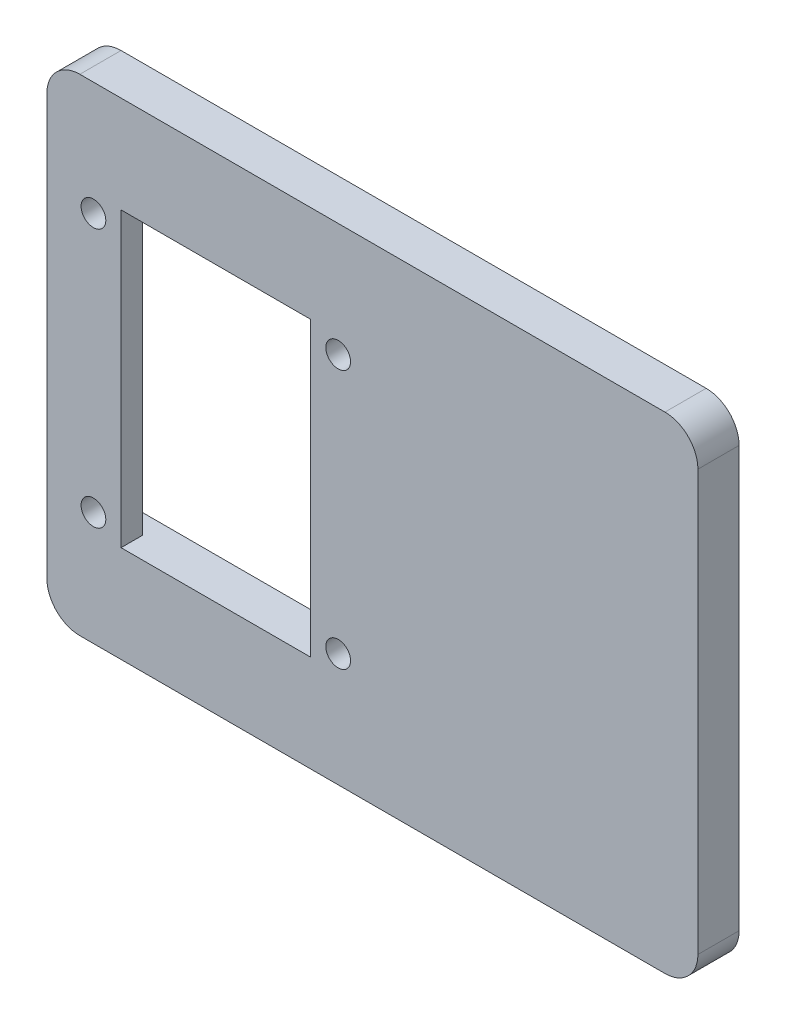
ISO-10303-21;
HEADER;
FILE_DESCRIPTION(('STEP AP214'),'2;1');
FILE_NAME('part.step','',(''),(''),'','','');
FILE_SCHEMA(('AUTOMOTIVE_DESIGN { 1 0 10303 214 1 1 1 1 }'));
ENDSEC;
DATA;
#1=APPLICATION_CONTEXT('core data for automotive mechanical design processes');
#2=APPLICATION_PROTOCOL_DEFINITION('international standard','automotive_design',2000,#1);
#3=PRODUCT_CONTEXT('',#1,'mechanical');
#4=PRODUCT('Part','Part','',(#3));
#5=PRODUCT_RELATED_PRODUCT_CATEGORY('part','',(#4));
#6=PRODUCT_DEFINITION_FORMATION('','',#4);
#7=PRODUCT_DEFINITION_CONTEXT('part definition',#1,'design');
#8=PRODUCT_DEFINITION('design','',#6,#7);
#9=PRODUCT_DEFINITION_SHAPE('','',#8);
#10=(LENGTH_UNIT() NAMED_UNIT(*) SI_UNIT(.MILLI.,.METRE.));
#11=(NAMED_UNIT(*) PLANE_ANGLE_UNIT() SI_UNIT($,.RADIAN.));
#12=(NAMED_UNIT(*) SI_UNIT($,.STERADIAN.) SOLID_ANGLE_UNIT());
#13=UNCERTAINTY_MEASURE_WITH_UNIT(LENGTH_MEASURE(1.E-05),#10,'distance_accuracy_value','');
#14=(GEOMETRIC_REPRESENTATION_CONTEXT(3) GLOBAL_UNCERTAINTY_ASSIGNED_CONTEXT((#13)) GLOBAL_UNIT_ASSIGNED_CONTEXT((#10,
#11,#12)) REPRESENTATION_CONTEXT('',''));
#15=CARTESIAN_POINT('',(0.,0.,0.));
#16=DIRECTION('',(0.,0.,1.));
#17=DIRECTION('',(1.,0.,0.));
#18=AXIS2_PLACEMENT_3D('',#15,#16,#17);
#19=CARTESIAN_POINT('',(0.,0.,5.));
#20=DIRECTION('',(0.,0.,-1.));
#21=DIRECTION('',(-1.,0.,0.));
#22=AXIS2_PLACEMENT_3D('',#19,#20,#21);
#23=PLANE('',#22);
#24=CARTESIAN_POINT('',(-33.85,15.71,5.));
#25=DIRECTION('',(0.,0.,1.));
#26=DIRECTION('',(1.,0.,0.));
#27=AXIS2_PLACEMENT_3D('',#24,#25,#26);
#28=CIRCLE('',#27,1.5);
#29=CARTESIAN_POINT('',(-32.35,15.71,5.));
#30=VERTEX_POINT('',#29);
#31=EDGE_CURVE('E202',#30,#30,#28,.T.);
#32=ORIENTED_EDGE('',*,*,#31,.F.);
#33=EDGE_LOOP('',(#32));
#34=FACE_BOUND('',#33,.T.);
#35=CARTESIAN_POINT('',(-4.14999999999999,15.71,5.));
#36=DIRECTION('',(0.,0.,1.));
#37=DIRECTION('',(1.,0.,0.));
#38=AXIS2_PLACEMENT_3D('',#35,#36,#37);
#39=CIRCLE('',#38,1.50000000000002);
#40=CARTESIAN_POINT('',(-2.64999999999997,15.71,5.));
#41=VERTEX_POINT('',#40);
#42=EDGE_CURVE('E235',#41,#41,#39,.F.);
#43=ORIENTED_EDGE('',*,*,#42,.T.);
#44=EDGE_LOOP('',(#43));
#45=FACE_BOUND('',#44,.T.);
#46=DIRECTION('',(-1.,0.,0.));
#47=VECTOR('',#46,1.);
#48=CARTESIAN_POINT('',(-39.5,29.5,5.));
#49=LINE('',#48,#47);
#50=CARTESIAN_POINT('',(35.5,29.5,5.));
#51=VERTEX_POINT('',#50);
#52=CARTESIAN_POINT('',(-35.5,29.5,5.));
#53=VERTEX_POINT('',#52);
#54=EDGE_CURVE('E248',#51,#53,#49,.T.);
#55=ORIENTED_EDGE('',*,*,#54,.T.);
#56=CARTESIAN_POINT('',(-35.5,25.5,5.));
#57=DIRECTION('',(0.,0.,-1.));
#58=DIRECTION('',(-1.,0.,0.));
#59=AXIS2_PLACEMENT_3D('',#56,#57,#58);
#60=CIRCLE('',#59,4.);
#61=CARTESIAN_POINT('',(-39.5,25.5,5.));
#62=VERTEX_POINT('',#61);
#63=EDGE_CURVE('E288',#53,#62,#60,.F.);
#64=ORIENTED_EDGE('',*,*,#63,.T.);
#65=DIRECTION('',(0.,-1.,0.));
#66=VECTOR('',#65,1.);
#67=CARTESIAN_POINT('',(-39.5,-29.5,5.));
#68=LINE('',#67,#66);
#69=CARTESIAN_POINT('',(-39.5,-25.5,5.));
#70=VERTEX_POINT('',#69);
#71=EDGE_CURVE('E252',#62,#70,#68,.T.);
#72=ORIENTED_EDGE('',*,*,#71,.T.);
#73=CARTESIAN_POINT('',(-35.5,-25.5,5.));
#74=DIRECTION('',(0.,0.,-1.));
#75=DIRECTION('',(-1.,0.,0.));
#76=AXIS2_PLACEMENT_3D('',#73,#74,#75);
#77=CIRCLE('',#76,4.);
#78=CARTESIAN_POINT('',(-35.5,-29.5,5.));
#79=VERTEX_POINT('',#78);
#80=EDGE_CURVE('E57',#70,#79,#77,.F.);
#81=ORIENTED_EDGE('',*,*,#80,.T.);
#82=DIRECTION('',(1.,0.,0.));
#83=VECTOR('',#82,1.);
#84=CARTESIAN_POINT('',(-39.5,-29.5,5.));
#85=LINE('',#84,#83);
#86=CARTESIAN_POINT('',(35.5,-29.5,5.));
#87=VERTEX_POINT('',#86);
#88=EDGE_CURVE('E254',#79,#87,#85,.T.);
#89=ORIENTED_EDGE('',*,*,#88,.T.);
#90=CARTESIAN_POINT('',(35.5,-25.5,5.));
#91=DIRECTION('',(0.,0.,-1.));
#92=DIRECTION('',(-1.,0.,0.));
#93=AXIS2_PLACEMENT_3D('',#90,#91,#92);
#94=CIRCLE('',#93,4.);
#95=CARTESIAN_POINT('',(39.5,-25.5,5.));
#96=VERTEX_POINT('',#95);
#97=EDGE_CURVE('E285',#87,#96,#94,.F.);
#98=ORIENTED_EDGE('',*,*,#97,.T.);
#99=DIRECTION('',(0.,1.,0.));
#100=VECTOR('',#99,1.);
#101=CARTESIAN_POINT('',(39.5,-29.5,5.));
#102=LINE('',#101,#100);
#103=CARTESIAN_POINT('',(39.5,25.5,5.));
#104=VERTEX_POINT('',#103);
#105=EDGE_CURVE('E245',#96,#104,#102,.T.);
#106=ORIENTED_EDGE('',*,*,#105,.T.);
#107=CARTESIAN_POINT('',(35.5,25.5,5.));
#108=DIRECTION('',(0.,0.,-1.));
#109=DIRECTION('',(-1.,0.,0.));
#110=AXIS2_PLACEMENT_3D('',#107,#108,#109);
#111=CIRCLE('',#110,4.);
#112=EDGE_CURVE('E283',#104,#51,#111,.F.);
#113=ORIENTED_EDGE('',*,*,#112,.T.);
#114=EDGE_LOOP('',(#55,#64,#72,#81,#89,#98,#106,#113));
#115=FACE_BOUND('',#114,.T.);
#116=DIRECTION('',(0.,1.,0.));
#117=VECTOR('',#116,1.);
#118=CARTESIAN_POINT('',(-7.49999999999999,0.,5.));
#119=LINE('',#118,#117);
#120=CARTESIAN_POINT('',(-7.49999999999999,-17.75,5.));
#121=VERTEX_POINT('',#120);
#122=CARTESIAN_POINT('',(-7.49999999999999,17.75,5.));
#123=VERTEX_POINT('',#122);
#124=EDGE_CURVE('E215',#121,#123,#119,.T.);
#125=ORIENTED_EDGE('',*,*,#124,.F.);
#126=DIRECTION('',(1.,0.,0.));
#127=VECTOR('',#126,1.);
#128=CARTESIAN_POINT('',(0.,-17.75,5.));
#129=LINE('',#128,#127);
#130=CARTESIAN_POINT('',(-30.5,-17.75,5.));
#131=VERTEX_POINT('',#130);
#132=EDGE_CURVE('E213',#131,#121,#129,.T.);
#133=ORIENTED_EDGE('',*,*,#132,.F.);
#134=DIRECTION('',(0.,1.,0.));
#135=VECTOR('',#134,1.);
#136=CARTESIAN_POINT('',(-30.5,0.,5.));
#137=LINE('',#136,#135);
#138=CARTESIAN_POINT('',(-30.5,17.75,5.));
#139=VERTEX_POINT('',#138);
#140=EDGE_CURVE('E209',#131,#139,#137,.T.);
#141=ORIENTED_EDGE('',*,*,#140,.T.);
#142=DIRECTION('',(1.,0.,0.));
#143=VECTOR('',#142,1.);
#144=CARTESIAN_POINT('',(0.,17.75,5.));
#145=LINE('',#144,#143);
#146=EDGE_CURVE('E218',#139,#123,#145,.T.);
#147=ORIENTED_EDGE('',*,*,#146,.T.);
#148=EDGE_LOOP('',(#125,#133,#141,#147));
#149=FACE_BOUND('',#148,.T.);
#150=CARTESIAN_POINT('',(-33.85,-15.71,5.));
#151=DIRECTION('',(0.,0.,1.));
#152=DIRECTION('',(1.,0.,0.));
#153=AXIS2_PLACEMENT_3D('',#150,#151,#152);
#154=CIRCLE('',#153,1.5);
#155=CARTESIAN_POINT('',(-32.35,-15.71,5.));
#156=VERTEX_POINT('',#155);
#157=EDGE_CURVE('E205',#156,#156,#154,.F.);
#158=ORIENTED_EDGE('',*,*,#157,.T.);
#159=EDGE_LOOP('',(#158));
#160=FACE_BOUND('',#159,.T.);
#161=CARTESIAN_POINT('',(-4.14999999999999,-15.71,5.));
#162=DIRECTION('',(0.,0.,1.));
#163=DIRECTION('',(1.,0.,0.));
#164=AXIS2_PLACEMENT_3D('',#161,#162,#163);
#165=CIRCLE('',#164,1.50000000000002);
#166=CARTESIAN_POINT('',(-2.64999999999997,-15.71,5.));
#167=VERTEX_POINT('',#166);
#168=EDGE_CURVE('E232',#167,#167,#165,.T.);
#169=ORIENTED_EDGE('',*,*,#168,.F.);
#170=EDGE_LOOP('',(#169));
#171=FACE_BOUND('',#170,.T.);
#172=ADVANCED_FACE('F35',(#34,#45,#115,#149,#160,#171),#23,.F.);
#173=CARTESIAN_POINT('',(39.5,-29.5,5.));
#174=DIRECTION('',(-1.,0.,0.));
#175=DIRECTION('',(0.,0.,1.));
#176=AXIS2_PLACEMENT_3D('',#173,#174,#175);
#177=PLANE('',#176);
#178=ORIENTED_EDGE('',*,*,#105,.F.);
#179=DIRECTION('',(0.,0.,-1.));
#180=VECTOR('',#179,1.);
#181=CARTESIAN_POINT('',(39.5,-25.5,5.));
#182=LINE('',#181,#180);
#183=CARTESIAN_POINT('',(39.5,-25.5,0.));
#184=VERTEX_POINT('',#183);
#185=EDGE_CURVE('E11',#96,#184,#182,.T.);
#186=ORIENTED_EDGE('',*,*,#185,.T.);
#187=DIRECTION('',(0.,1.,0.));
#188=VECTOR('',#187,1.);
#189=CARTESIAN_POINT('',(39.5,-29.5,0.));
#190=LINE('',#189,#188);
#191=CARTESIAN_POINT('',(39.5,25.5,0.));
#192=VERTEX_POINT('',#191);
#193=EDGE_CURVE('E244',#184,#192,#190,.T.);
#194=ORIENTED_EDGE('',*,*,#193,.T.);
#195=DIRECTION('',(0.,0.,-1.));
#196=VECTOR('',#195,1.);
#197=CARTESIAN_POINT('',(39.5,25.5,5.));
#198=LINE('',#197,#196);
#199=EDGE_CURVE('E43',#192,#104,#198,.F.);
#200=ORIENTED_EDGE('',*,*,#199,.T.);
#201=EDGE_LOOP('',(#178,#186,#194,#200));
#202=FACE_BOUND('',#201,.T.);
#203=ADVANCED_FACE('F296',(#202),#177,.F.);
#204=CARTESIAN_POINT('',(-39.5,29.5,5.));
#205=DIRECTION('',(0.,-1.,0.));
#206=DIRECTION('',(0.,0.,-1.));
#207=AXIS2_PLACEMENT_3D('',#204,#205,#206);
#208=PLANE('',#207);
#209=DIRECTION('',(-1.,0.,0.));
#210=VECTOR('',#209,1.);
#211=CARTESIAN_POINT('',(-39.5,29.5,0.));
#212=LINE('',#211,#210);
#213=CARTESIAN_POINT('',(35.5,29.5,0.));
#214=VERTEX_POINT('',#213);
#215=CARTESIAN_POINT('',(-35.5,29.5,0.));
#216=VERTEX_POINT('',#215);
#217=EDGE_CURVE('E259',#214,#216,#212,.T.);
#218=ORIENTED_EDGE('',*,*,#217,.T.);
#219=DIRECTION('',(0.,0.,-1.));
#220=VECTOR('',#219,1.);
#221=CARTESIAN_POINT('',(-35.5,29.5,5.));
#222=LINE('',#221,#220);
#223=EDGE_CURVE('E281',#216,#53,#222,.F.);
#224=ORIENTED_EDGE('',*,*,#223,.T.);
#225=ORIENTED_EDGE('',*,*,#54,.F.);
#226=DIRECTION('',(0.,0.,-1.));
#227=VECTOR('',#226,1.);
#228=CARTESIAN_POINT('',(35.5,29.5,5.));
#229=LINE('',#228,#227);
#230=EDGE_CURVE('E278',#51,#214,#229,.T.);
#231=ORIENTED_EDGE('',*,*,#230,.T.);
#232=EDGE_LOOP('',(#218,#224,#225,#231));
#233=FACE_BOUND('',#232,.T.);
#234=ADVANCED_FACE('F307',(#233),#208,.F.);
#235=CARTESIAN_POINT('',(-39.5,-29.5,5.));
#236=DIRECTION('',(1.,0.,0.));
#237=DIRECTION('',(0.,0.,-1.));
#238=AXIS2_PLACEMENT_3D('',#235,#236,#237);
#239=PLANE('',#238);
#240=ORIENTED_EDGE('',*,*,#71,.F.);
#241=DIRECTION('',(0.,0.,-1.));
#242=VECTOR('',#241,1.);
#243=CARTESIAN_POINT('',(-39.5,25.5,5.));
#244=LINE('',#243,#242);
#245=CARTESIAN_POINT('',(-39.5,25.5,0.));
#246=VERTEX_POINT('',#245);
#247=EDGE_CURVE('E267',#62,#246,#244,.T.);
#248=ORIENTED_EDGE('',*,*,#247,.T.);
#249=DIRECTION('',(0.,-1.,0.));
#250=VECTOR('',#249,1.);
#251=CARTESIAN_POINT('',(-39.5,-29.5,0.));
#252=LINE('',#251,#250);
#253=CARTESIAN_POINT('',(-39.5,-25.5,0.));
#254=VERTEX_POINT('',#253);
#255=EDGE_CURVE('E262',#246,#254,#252,.T.);
#256=ORIENTED_EDGE('',*,*,#255,.T.);
#257=DIRECTION('',(0.,0.,-1.));
#258=VECTOR('',#257,1.);
#259=CARTESIAN_POINT('',(-39.5,-25.5,5.));
#260=LINE('',#259,#258);
#261=EDGE_CURVE('E256',#254,#70,#260,.F.);
#262=ORIENTED_EDGE('',*,*,#261,.T.);
#263=EDGE_LOOP('',(#240,#248,#256,#262));
#264=FACE_BOUND('',#263,.T.);
#265=ADVANCED_FACE('F318',(#264),#239,.F.);
#266=CARTESIAN_POINT('',(-39.5,-29.5,5.));
#267=DIRECTION('',(0.,1.,0.));
#268=DIRECTION('',(0.,0.,1.));
#269=AXIS2_PLACEMENT_3D('',#266,#267,#268);
#270=PLANE('',#269);
#271=ORIENTED_EDGE('',*,*,#88,.F.);
#272=DIRECTION('',(0.,0.,-1.));
#273=VECTOR('',#272,1.);
#274=CARTESIAN_POINT('',(-35.5,-29.5,5.));
#275=LINE('',#274,#273);
#276=CARTESIAN_POINT('',(-35.5,-29.5,0.));
#277=VERTEX_POINT('',#276);
#278=EDGE_CURVE('E291',#79,#277,#275,.T.);
#279=ORIENTED_EDGE('',*,*,#278,.T.);
#280=DIRECTION('',(1.,0.,0.));
#281=VECTOR('',#280,1.);
#282=CARTESIAN_POINT('',(-39.5,-29.5,0.));
#283=LINE('',#282,#281);
#284=CARTESIAN_POINT('',(35.5,-29.5,0.));
#285=VERTEX_POINT('',#284);
#286=EDGE_CURVE('E249',#277,#285,#283,.T.);
#287=ORIENTED_EDGE('',*,*,#286,.T.);
#288=DIRECTION('',(0.,0.,-1.));
#289=VECTOR('',#288,1.);
#290=CARTESIAN_POINT('',(35.5,-29.5,5.));
#291=LINE('',#290,#289);
#292=EDGE_CURVE('E50',#285,#87,#291,.F.);
#293=ORIENTED_EDGE('',*,*,#292,.T.);
#294=EDGE_LOOP('',(#271,#279,#287,#293));
#295=FACE_BOUND('',#294,.T.);
#296=ADVANCED_FACE('F324',(#295),#270,.F.);
#297=CARTESIAN_POINT('',(0.,0.,0.));
#298=DIRECTION('',(0.,0.,-1.));
#299=DIRECTION('',(-1.,0.,0.));
#300=AXIS2_PLACEMENT_3D('',#297,#298,#299);
#301=PLANE('',#300);
#302=DIRECTION('',(1.,0.,0.));
#303=VECTOR('',#302,1.);
#304=CARTESIAN_POINT('',(0.,17.75,0.));
#305=LINE('',#304,#303);
#306=CARTESIAN_POINT('',(-35.85,17.75,0.));
#307=VERTEX_POINT('',#306);
#308=CARTESIAN_POINT('',(-2.14999999999999,17.75,0.));
#309=VERTEX_POINT('',#308);
#310=EDGE_CURVE('E167',#307,#309,#305,.T.);
#311=ORIENTED_EDGE('',*,*,#310,.F.);
#312=DIRECTION('',(0.,-1.,0.));
#313=VECTOR('',#312,1.);
#314=CARTESIAN_POINT('',(-35.85,0.,0.));
#315=LINE('',#314,#313);
#316=CARTESIAN_POINT('',(-35.85,-17.75,0.));
#317=VERTEX_POINT('',#316);
#318=EDGE_CURVE('E160',#307,#317,#315,.T.);
#319=ORIENTED_EDGE('',*,*,#318,.T.);
#320=DIRECTION('',(1.,0.,0.));
#321=VECTOR('',#320,1.);
#322=CARTESIAN_POINT('',(0.,-17.75,0.));
#323=LINE('',#322,#321);
#324=CARTESIAN_POINT('',(-2.15,-17.75,0.));
#325=VERTEX_POINT('',#324);
#326=EDGE_CURVE('E186',#317,#325,#323,.T.);
#327=ORIENTED_EDGE('',*,*,#326,.T.);
#328=DIRECTION('',(0.,-1.,0.));
#329=VECTOR('',#328,1.);
#330=CARTESIAN_POINT('',(-2.15,0.,0.));
#331=LINE('',#330,#329);
#332=EDGE_CURVE('E184',#309,#325,#331,.T.);
#333=ORIENTED_EDGE('',*,*,#332,.F.);
#334=EDGE_LOOP('',(#311,#319,#327,#333));
#335=FACE_BOUND('',#334,.T.);
#336=ORIENTED_EDGE('',*,*,#255,.F.);
#337=CARTESIAN_POINT('',(-35.5,25.5,0.));
#338=DIRECTION('',(0.,0.,-1.));
#339=DIRECTION('',(-1.,0.,0.));
#340=AXIS2_PLACEMENT_3D('',#337,#338,#339);
#341=CIRCLE('',#340,4.);
#342=EDGE_CURVE('E276',#246,#216,#341,.T.);
#343=ORIENTED_EDGE('',*,*,#342,.T.);
#344=ORIENTED_EDGE('',*,*,#217,.F.);
#345=CARTESIAN_POINT('',(35.5,25.5,0.));
#346=DIRECTION('',(0.,0.,-1.));
#347=DIRECTION('',(-1.,0.,0.));
#348=AXIS2_PLACEMENT_3D('',#345,#346,#347);
#349=CIRCLE('',#348,4.);
#350=EDGE_CURVE('E270',#214,#192,#349,.T.);
#351=ORIENTED_EDGE('',*,*,#350,.T.);
#352=ORIENTED_EDGE('',*,*,#193,.F.);
#353=CARTESIAN_POINT('',(35.5,-25.5,0.));
#354=DIRECTION('',(0.,0.,-1.));
#355=DIRECTION('',(-1.,0.,0.));
#356=AXIS2_PLACEMENT_3D('',#353,#354,#355);
#357=CIRCLE('',#356,4.);
#358=EDGE_CURVE('E272',#184,#285,#357,.T.);
#359=ORIENTED_EDGE('',*,*,#358,.T.);
#360=ORIENTED_EDGE('',*,*,#286,.F.);
#361=CARTESIAN_POINT('',(-35.5,-25.5,0.));
#362=DIRECTION('',(0.,0.,-1.));
#363=DIRECTION('',(-1.,0.,0.));
#364=AXIS2_PLACEMENT_3D('',#361,#362,#363);
#365=CIRCLE('',#364,4.);
#366=EDGE_CURVE('E274',#277,#254,#365,.T.);
#367=ORIENTED_EDGE('',*,*,#366,.T.);
#368=EDGE_LOOP('',(#336,#343,#344,#351,#352,#359,#360,#367));
#369=FACE_BOUND('',#368,.T.);
#370=ADVANCED_FACE('F311',(#335,#369),#301,.T.);
#371=CARTESIAN_POINT('',(-4.14999999999999,15.71,2.4));
#372=DIRECTION('',(0.,0.,1.));
#373=DIRECTION('',(1.,0.,0.));
#374=AXIS2_PLACEMENT_3D('',#371,#372,#373);
#375=CYLINDRICAL_SURFACE('',#374,1.50000000000002);
#376=CARTESIAN_POINT('',(-4.14999999999999,15.71,2.4));
#377=DIRECTION('',(0.,0.,1.));
#378=DIRECTION('',(1.,0.,0.));
#379=AXIS2_PLACEMENT_3D('',#376,#377,#378);
#380=CIRCLE('',#379,1.50000000000002);
#381=CARTESIAN_POINT('',(-2.64999999999997,15.71,2.4));
#382=VERTEX_POINT('',#381);
#383=EDGE_CURVE('E200',#382,#382,#380,.F.);
#384=ORIENTED_EDGE('',*,*,#383,.T.);
#385=EDGE_LOOP('',(#384));
#386=FACE_BOUND('',#385,.T.);
#387=ORIENTED_EDGE('',*,*,#42,.F.);
#388=EDGE_LOOP('',(#387));
#389=FACE_BOUND('',#388,.T.);
#390=ADVANCED_FACE('F344',(#386,#389),#375,.F.);
#391=CARTESIAN_POINT('',(0.,-17.75,2.4));
#392=DIRECTION('',(0.,-1.,0.));
#393=DIRECTION('',(0.,0.,-1.));
#394=AXIS2_PLACEMENT_3D('',#391,#392,#393);
#395=PLANE('',#394);
#396=ORIENTED_EDGE('',*,*,#132,.T.);
#397=DIRECTION('',(0.,0.,1.));
#398=VECTOR('',#397,1.);
#399=CARTESIAN_POINT('',(-7.49999999999999,-17.75,2.4));
#400=LINE('',#399,#398);
#401=CARTESIAN_POINT('',(-7.49999999999999,-17.75,2.4));
#402=VERTEX_POINT('',#401);
#403=EDGE_CURVE('E212',#402,#121,#400,.T.);
#404=ORIENTED_EDGE('',*,*,#403,.F.);
#405=DIRECTION('',(1.,0.,0.));
#406=VECTOR('',#405,1.);
#407=CARTESIAN_POINT('',(0.,-17.75,2.4));
#408=LINE('',#407,#406);
#409=CARTESIAN_POINT('',(-2.15,-17.75,2.4));
#410=VERTEX_POINT('',#409);
#411=EDGE_CURVE('E176',#402,#410,#408,.T.);
#412=ORIENTED_EDGE('',*,*,#411,.T.);
#413=DIRECTION('',(0.,0.,-1.));
#414=VECTOR('',#413,1.);
#415=CARTESIAN_POINT('',(-2.15,-17.75,2.4));
#416=LINE('',#415,#414);
#417=EDGE_CURVE('E171',#410,#325,#416,.T.);
#418=ORIENTED_EDGE('',*,*,#417,.T.);
#419=ORIENTED_EDGE('',*,*,#326,.F.);
#420=DIRECTION('',(0.,0.,-1.));
#421=VECTOR('',#420,1.);
#422=CARTESIAN_POINT('',(-35.85,-17.75,2.4));
#423=LINE('',#422,#421);
#424=CARTESIAN_POINT('',(-35.85,-17.75,2.4));
#425=VERTEX_POINT('',#424);
#426=EDGE_CURVE('E194',#425,#317,#423,.T.);
#427=ORIENTED_EDGE('',*,*,#426,.F.);
#428=CARTESIAN_POINT('',(-30.5,-17.75,2.4));
#429=VERTEX_POINT('',#428);
#430=EDGE_CURVE('E178',#425,#429,#408,.T.);
#431=ORIENTED_EDGE('',*,*,#430,.T.);
#432=DIRECTION('',(0.,0.,1.));
#433=VECTOR('',#432,1.);
#434=CARTESIAN_POINT('',(-30.5,-17.75,2.4));
#435=LINE('',#434,#433);
#436=EDGE_CURVE('E206',#429,#131,#435,.T.);
#437=ORIENTED_EDGE('',*,*,#436,.T.);
#438=EDGE_LOOP('',(#396,#404,#412,#418,#419,#427,#431,#437));
#439=FACE_BOUND('',#438,.T.);
#440=ADVANCED_FACE('F378',(#439),#395,.F.);
#441=CARTESIAN_POINT('',(-30.5,0.,2.4));
#442=DIRECTION('',(1.,0.,0.));
#443=DIRECTION('',(0.,0.,-1.));
#444=AXIS2_PLACEMENT_3D('',#441,#442,#443);
#445=PLANE('',#444);
#446=ORIENTED_EDGE('',*,*,#140,.F.);
#447=ORIENTED_EDGE('',*,*,#436,.F.);
#448=DIRECTION('',(0.,1.,0.));
#449=VECTOR('',#448,1.);
#450=CARTESIAN_POINT('',(-30.5,0.,2.4));
#451=LINE('',#450,#449);
#452=CARTESIAN_POINT('',(-30.5,17.75,2.4));
#453=VERTEX_POINT('',#452);
#454=EDGE_CURVE('E208',#429,#453,#451,.T.);
#455=ORIENTED_EDGE('',*,*,#454,.T.);
#456=DIRECTION('',(0.,0.,1.));
#457=VECTOR('',#456,1.);
#458=CARTESIAN_POINT('',(-30.5,17.75,2.4));
#459=LINE('',#458,#457);
#460=EDGE_CURVE('E224',#453,#139,#459,.T.);
#461=ORIENTED_EDGE('',*,*,#460,.T.);
#462=EDGE_LOOP('',(#446,#447,#455,#461));
#463=FACE_BOUND('',#462,.T.);
#464=ADVANCED_FACE('F375',(#463),#445,.T.);
#465=CARTESIAN_POINT('',(0.,17.75,2.4));
#466=DIRECTION('',(0.,-1.,0.));
#467=DIRECTION('',(0.,0.,-1.));
#468=AXIS2_PLACEMENT_3D('',#465,#466,#467);
#469=PLANE('',#468);
#470=ORIENTED_EDGE('',*,*,#146,.F.);
#471=ORIENTED_EDGE('',*,*,#460,.F.);
#472=DIRECTION('',(1.,0.,0.));
#473=VECTOR('',#472,1.);
#474=CARTESIAN_POINT('',(0.,17.75,2.4));
#475=LINE('',#474,#473);
#476=CARTESIAN_POINT('',(-35.85,17.75,2.4));
#477=VERTEX_POINT('',#476);
#478=EDGE_CURVE('E159',#477,#453,#475,.T.);
#479=ORIENTED_EDGE('',*,*,#478,.F.);
#480=DIRECTION('',(0.,0.,-1.));
#481=VECTOR('',#480,1.);
#482=CARTESIAN_POINT('',(-35.85,17.75,2.4));
#483=LINE('',#482,#481);
#484=EDGE_CURVE('E191',#477,#307,#483,.T.);
#485=ORIENTED_EDGE('',*,*,#484,.T.);
#486=ORIENTED_EDGE('',*,*,#310,.T.);
#487=DIRECTION('',(0.,0.,-1.));
#488=VECTOR('',#487,1.);
#489=CARTESIAN_POINT('',(-2.14999999999999,17.75,2.4));
#490=LINE('',#489,#488);
#491=CARTESIAN_POINT('',(-2.14999999999999,17.75,2.4));
#492=VERTEX_POINT('',#491);
#493=EDGE_CURVE('E163',#492,#309,#490,.T.);
#494=ORIENTED_EDGE('',*,*,#493,.F.);
#495=CARTESIAN_POINT('',(-7.49999999999999,17.75,2.4));
#496=VERTEX_POINT('',#495);
#497=EDGE_CURVE('E150',#496,#492,#475,.T.);
#498=ORIENTED_EDGE('',*,*,#497,.F.);
#499=DIRECTION('',(0.,0.,1.));
#500=VECTOR('',#499,1.);
#501=CARTESIAN_POINT('',(-7.49999999999999,17.75,2.4));
#502=LINE('',#501,#500);
#503=EDGE_CURVE('E226',#496,#123,#502,.T.);
#504=ORIENTED_EDGE('',*,*,#503,.T.);
#505=EDGE_LOOP('',(#470,#471,#479,#485,#486,#494,#498,#504));
#506=FACE_BOUND('',#505,.T.);
#507=ADVANCED_FACE('F165',(#506),#469,.T.);
#508=CARTESIAN_POINT('',(-7.49999999999999,0.,2.4));
#509=DIRECTION('',(1.,0.,0.));
#510=DIRECTION('',(0.,0.,-1.));
#511=AXIS2_PLACEMENT_3D('',#508,#509,#510);
#512=PLANE('',#511);
#513=ORIENTED_EDGE('',*,*,#124,.T.);
#514=ORIENTED_EDGE('',*,*,#503,.F.);
#515=DIRECTION('',(0.,1.,0.));
#516=VECTOR('',#515,1.);
#517=CARTESIAN_POINT('',(-7.49999999999999,0.,2.4));
#518=LINE('',#517,#516);
#519=EDGE_CURVE('E156',#402,#496,#518,.T.);
#520=ORIENTED_EDGE('',*,*,#519,.F.);
#521=ORIENTED_EDGE('',*,*,#403,.T.);
#522=EDGE_LOOP('',(#513,#514,#520,#521));
#523=FACE_BOUND('',#522,.T.);
#524=ADVANCED_FACE('F373',(#523),#512,.F.);
#525=CARTESIAN_POINT('',(-33.85,15.71,2.4));
#526=DIRECTION('',(0.,0.,1.));
#527=DIRECTION('',(1.,0.,0.));
#528=AXIS2_PLACEMENT_3D('',#525,#526,#527);
#529=CYLINDRICAL_SURFACE('',#528,1.5);
#530=CARTESIAN_POINT('',(-33.85,15.71,2.4));
#531=DIRECTION('',(0.,0.,1.));
#532=DIRECTION('',(1.,0.,0.));
#533=AXIS2_PLACEMENT_3D('',#530,#531,#532);
#534=CIRCLE('',#533,1.5);
#535=CARTESIAN_POINT('',(-32.35,15.71,2.4));
#536=VERTEX_POINT('',#535);
#537=EDGE_CURVE('E197',#536,#536,#534,.T.);
#538=ORIENTED_EDGE('',*,*,#537,.F.);
#539=EDGE_LOOP('',(#538));
#540=FACE_BOUND('',#539,.T.);
#541=ORIENTED_EDGE('',*,*,#31,.T.);
#542=EDGE_LOOP('',(#541));
#543=FACE_BOUND('',#542,.T.);
#544=ADVANCED_FACE('F369',(#540,#543),#529,.F.);
#545=CARTESIAN_POINT('',(-33.85,-15.71,2.4));
#546=DIRECTION('',(0.,0.,1.));
#547=DIRECTION('',(1.,0.,0.));
#548=AXIS2_PLACEMENT_3D('',#545,#546,#547);
#549=CYLINDRICAL_SURFACE('',#548,1.5);
#550=CARTESIAN_POINT('',(-33.85,-15.71,2.4));
#551=DIRECTION('',(0.,0.,1.));
#552=DIRECTION('',(1.,0.,0.));
#553=AXIS2_PLACEMENT_3D('',#550,#551,#552);
#554=CIRCLE('',#553,1.5);
#555=CARTESIAN_POINT('',(-32.35,-15.71,2.4));
#556=VERTEX_POINT('',#555);
#557=EDGE_CURVE('E201',#556,#556,#554,.F.);
#558=ORIENTED_EDGE('',*,*,#557,.T.);
#559=EDGE_LOOP('',(#558));
#560=FACE_BOUND('',#559,.T.);
#561=ORIENTED_EDGE('',*,*,#157,.F.);
#562=EDGE_LOOP('',(#561));
#563=FACE_BOUND('',#562,.T.);
#564=ADVANCED_FACE('F372',(#560,#563),#549,.F.);
#565=CARTESIAN_POINT('',(-4.14999999999999,-15.71,2.4));
#566=DIRECTION('',(0.,0.,1.));
#567=DIRECTION('',(1.,0.,0.));
#568=AXIS2_PLACEMENT_3D('',#565,#566,#567);
#569=CYLINDRICAL_SURFACE('',#568,1.50000000000002);
#570=CARTESIAN_POINT('',(-4.14999999999999,-15.71,2.4));
#571=DIRECTION('',(0.,0.,1.));
#572=DIRECTION('',(1.,0.,0.));
#573=AXIS2_PLACEMENT_3D('',#570,#571,#572);
#574=CIRCLE('',#573,1.50000000000002);
#575=CARTESIAN_POINT('',(-2.64999999999997,-15.71,2.4));
#576=VERTEX_POINT('',#575);
#577=EDGE_CURVE('E193',#576,#576,#574,.T.);
#578=ORIENTED_EDGE('',*,*,#577,.F.);
#579=EDGE_LOOP('',(#578));
#580=FACE_BOUND('',#579,.T.);
#581=ORIENTED_EDGE('',*,*,#168,.T.);
#582=EDGE_LOOP('',(#581));
#583=FACE_BOUND('',#582,.T.);
#584=ADVANCED_FACE('F388',(#580,#583),#569,.F.);
#585=CARTESIAN_POINT('',(0.,0.,2.4));
#586=DIRECTION('',(0.,0.,-1.));
#587=DIRECTION('',(-1.,0.,0.));
#588=AXIS2_PLACEMENT_3D('',#585,#586,#587);
#589=PLANE('',#588);
#590=ORIENTED_EDGE('',*,*,#383,.F.);
#591=EDGE_LOOP('',(#590));
#592=FACE_BOUND('',#591,.T.);
#593=ORIENTED_EDGE('',*,*,#577,.T.);
#594=EDGE_LOOP('',(#593));
#595=FACE_BOUND('',#594,.T.);
#596=ORIENTED_EDGE('',*,*,#519,.T.);
#597=ORIENTED_EDGE('',*,*,#497,.T.);
#598=DIRECTION('',(0.,-1.,0.));
#599=VECTOR('',#598,1.);
#600=CARTESIAN_POINT('',(-2.15,0.,2.4));
#601=LINE('',#600,#599);
#602=EDGE_CURVE('E154',#492,#410,#601,.T.);
#603=ORIENTED_EDGE('',*,*,#602,.T.);
#604=ORIENTED_EDGE('',*,*,#411,.F.);
#605=EDGE_LOOP('',(#596,#597,#603,#604));
#606=FACE_BOUND('',#605,.T.);
#607=ADVANCED_FACE('F152',(#592,#595,#606),#589,.T.);
#608=ORIENTED_EDGE('',*,*,#557,.F.);
#609=EDGE_LOOP('',(#608));
#610=FACE_BOUND('',#609,.T.);
#611=ORIENTED_EDGE('',*,*,#430,.F.);
#612=DIRECTION('',(0.,-1.,0.));
#613=VECTOR('',#612,1.);
#614=CARTESIAN_POINT('',(-35.85,0.,2.4));
#615=LINE('',#614,#613);
#616=EDGE_CURVE('E172',#477,#425,#615,.T.);
#617=ORIENTED_EDGE('',*,*,#616,.F.);
#618=ORIENTED_EDGE('',*,*,#478,.T.);
#619=ORIENTED_EDGE('',*,*,#454,.F.);
#620=EDGE_LOOP('',(#611,#617,#618,#619));
#621=FACE_BOUND('',#620,.T.);
#622=ORIENTED_EDGE('',*,*,#537,.T.);
#623=EDGE_LOOP('',(#622));
#624=FACE_BOUND('',#623,.T.);
#625=ADVANCED_FACE('F364',(#610,#621,#624),#589,.T.);
#626=CARTESIAN_POINT('',(-35.85,0.,2.4));
#627=DIRECTION('',(1.,0.,0.));
#628=DIRECTION('',(0.,0.,-1.));
#629=AXIS2_PLACEMENT_3D('',#626,#627,#628);
#630=PLANE('',#629);
#631=ORIENTED_EDGE('',*,*,#318,.F.);
#632=ORIENTED_EDGE('',*,*,#484,.F.);
#633=ORIENTED_EDGE('',*,*,#616,.T.);
#634=ORIENTED_EDGE('',*,*,#426,.T.);
#635=EDGE_LOOP('',(#631,#632,#633,#634));
#636=FACE_BOUND('',#635,.T.);
#637=ADVANCED_FACE('F359',(#636),#630,.T.);
#638=CARTESIAN_POINT('',(-2.15,0.,2.4));
#639=DIRECTION('',(1.,0.,0.));
#640=DIRECTION('',(0.,1.,0.));
#641=AXIS2_PLACEMENT_3D('',#638,#639,#640);
#642=PLANE('',#641);
#643=ORIENTED_EDGE('',*,*,#332,.T.);
#644=ORIENTED_EDGE('',*,*,#417,.F.);
#645=ORIENTED_EDGE('',*,*,#602,.F.);
#646=ORIENTED_EDGE('',*,*,#493,.T.);
#647=EDGE_LOOP('',(#643,#644,#645,#646));
#648=FACE_BOUND('',#647,.T.);
#649=ADVANCED_FACE('F175',(#648),#642,.F.);
#650=CARTESIAN_POINT('',(-35.5,25.5,5.));
#651=DIRECTION('',(0.,0.,-1.));
#652=DIRECTION('',(-1.,0.,0.));
#653=AXIS2_PLACEMENT_3D('',#650,#651,#652);
#654=CYLINDRICAL_SURFACE('',#653,4.);
#655=ORIENTED_EDGE('',*,*,#63,.F.);
#656=ORIENTED_EDGE('',*,*,#223,.F.);
#657=ORIENTED_EDGE('',*,*,#342,.F.);
#658=ORIENTED_EDGE('',*,*,#247,.F.);
#659=EDGE_LOOP('',(#655,#656,#657,#658));
#660=FACE_BOUND('',#659,.T.);
#661=ADVANCED_FACE('F315',(#660),#654,.T.);
#662=CARTESIAN_POINT('',(-35.5,-25.5,5.));
#663=DIRECTION('',(0.,0.,-1.));
#664=DIRECTION('',(-1.,0.,0.));
#665=AXIS2_PLACEMENT_3D('',#662,#663,#664);
#666=CYLINDRICAL_SURFACE('',#665,4.);
#667=ORIENTED_EDGE('',*,*,#80,.F.);
#668=ORIENTED_EDGE('',*,*,#261,.F.);
#669=ORIENTED_EDGE('',*,*,#366,.F.);
#670=ORIENTED_EDGE('',*,*,#278,.F.);
#671=EDGE_LOOP('',(#667,#668,#669,#670));
#672=FACE_BOUND('',#671,.T.);
#673=ADVANCED_FACE('F322',(#672),#666,.T.);
#674=CARTESIAN_POINT('',(35.5,-25.5,5.));
#675=DIRECTION('',(0.,0.,-1.));
#676=DIRECTION('',(-1.,0.,0.));
#677=AXIS2_PLACEMENT_3D('',#674,#675,#676);
#678=CYLINDRICAL_SURFACE('',#677,4.);
#679=ORIENTED_EDGE('',*,*,#97,.F.);
#680=ORIENTED_EDGE('',*,*,#292,.F.);
#681=ORIENTED_EDGE('',*,*,#358,.F.);
#682=ORIENTED_EDGE('',*,*,#185,.F.);
#683=EDGE_LOOP('',(#679,#680,#681,#682));
#684=FACE_BOUND('',#683,.T.);
#685=ADVANCED_FACE('F326',(#684),#678,.T.);
#686=CARTESIAN_POINT('',(35.5,25.5,5.));
#687=DIRECTION('',(0.,0.,-1.));
#688=DIRECTION('',(-1.,0.,0.));
#689=AXIS2_PLACEMENT_3D('',#686,#687,#688);
#690=CYLINDRICAL_SURFACE('',#689,4.);
#691=ORIENTED_EDGE('',*,*,#112,.F.);
#692=ORIENTED_EDGE('',*,*,#199,.F.);
#693=ORIENTED_EDGE('',*,*,#350,.F.);
#694=ORIENTED_EDGE('',*,*,#230,.F.);
#695=EDGE_LOOP('',(#691,#692,#693,#694));
#696=FACE_BOUND('',#695,.T.);
#697=ADVANCED_FACE('F37',(#696),#690,.T.);
#698=CLOSED_SHELL('',(#172,#203,#234,#265,#296,#370,#390,#440,#464,#507,#524,#544,#564,#584,
#607,#625,#637,#649,#661,#673,#685,#697));
#699=MANIFOLD_SOLID_BREP('B2',#698);
#700=ADVANCED_BREP_SHAPE_REPRESENTATION('',(#18,#699),#14);
#701=SHAPE_DEFINITION_REPRESENTATION(#9,#700);
ENDSEC;
END-ISO-10303-21;
